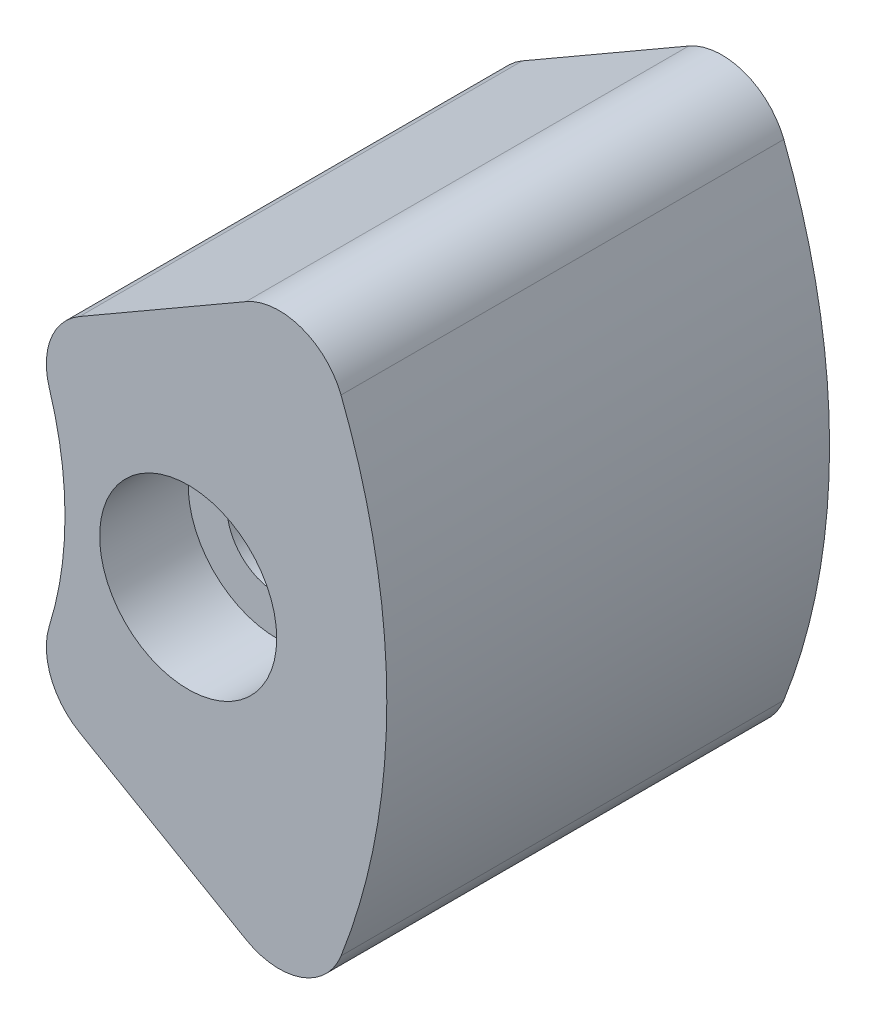
ISO-10303-21;
HEADER;
FILE_DESCRIPTION(('STEP AP214'),'2;1');
FILE_NAME('part.step','',(''),(''),'','','');
FILE_SCHEMA(('AUTOMOTIVE_DESIGN { 1 0 10303 214 1 1 1 1 }'));
ENDSEC;
DATA;
#1=APPLICATION_CONTEXT('core data for automotive mechanical design processes');
#2=APPLICATION_PROTOCOL_DEFINITION('international standard','automotive_design',2000,#1);
#3=PRODUCT_CONTEXT('',#1,'mechanical');
#4=PRODUCT('Part','Part','',(#3));
#5=PRODUCT_RELATED_PRODUCT_CATEGORY('part','',(#4));
#6=PRODUCT_DEFINITION_FORMATION('','',#4);
#7=PRODUCT_DEFINITION_CONTEXT('part definition',#1,'design');
#8=PRODUCT_DEFINITION('design','',#6,#7);
#9=PRODUCT_DEFINITION_SHAPE('','',#8);
#10=(LENGTH_UNIT() NAMED_UNIT(*) SI_UNIT(.MILLI.,.METRE.));
#11=(NAMED_UNIT(*) PLANE_ANGLE_UNIT() SI_UNIT($,.RADIAN.));
#12=(NAMED_UNIT(*) SI_UNIT($,.STERADIAN.) SOLID_ANGLE_UNIT());
#13=UNCERTAINTY_MEASURE_WITH_UNIT(LENGTH_MEASURE(1.E-05),#10,'distance_accuracy_value','');
#14=(GEOMETRIC_REPRESENTATION_CONTEXT(3) GLOBAL_UNCERTAINTY_ASSIGNED_CONTEXT((#13)) GLOBAL_UNIT_ASSIGNED_CONTEXT((#10,
#11,#12)) REPRESENTATION_CONTEXT('',''));
#15=CARTESIAN_POINT('',(0.,0.,0.));
#16=DIRECTION('',(0.,0.,1.));
#17=DIRECTION('',(1.,0.,0.));
#18=AXIS2_PLACEMENT_3D('',#15,#16,#17);
#19=CARTESIAN_POINT('',(233.99144856321,90.1215114657777,20.));
#20=DIRECTION('',(0.,0.,-1.));
#21=DIRECTION('',(-1.,0.,0.));
#22=AXIS2_PLACEMENT_3D('',#19,#20,#21);
#23=CYLINDRICAL_SURFACE('',#22,2.99999999999997);
#24=CARTESIAN_POINT('',(233.99144856321,90.1215114657777,0.));
#25=DIRECTION('',(0.,0.,1.));
#26=DIRECTION('',(1.,0.,0.));
#27=AXIS2_PLACEMENT_3D('',#24,#25,#26);
#28=CIRCLE('',#27,2.99999999999997);
#29=CARTESIAN_POINT('',(232.49144856321,87.5234352544244,0.));
#30=VERTEX_POINT('',#29);
#31=CARTESIAN_POINT('',(236.785753668764,89.0297885260752,0.));
#32=VERTEX_POINT('',#31);
#33=EDGE_CURVE('E128',#30,#32,#28,.T.);
#34=ORIENTED_EDGE('',*,*,#33,.T.);
#35=DIRECTION('',(0.,0.,-1.));
#36=VECTOR('',#35,1.);
#37=CARTESIAN_POINT('',(236.785753668764,89.0297885260752,20.));
#38=LINE('',#37,#36);
#39=CARTESIAN_POINT('',(236.785753668764,89.0297885260752,20.));
#40=VERTEX_POINT('',#39);
#41=EDGE_CURVE('E11',#40,#32,#38,.T.);
#42=ORIENTED_EDGE('',*,*,#41,.F.);
#43=CARTESIAN_POINT('',(233.99144856321,90.1215114657777,20.));
#44=DIRECTION('',(0.,0.,1.));
#45=DIRECTION('',(1.,0.,0.));
#46=AXIS2_PLACEMENT_3D('',#43,#44,#45);
#47=CIRCLE('',#46,2.99999999999997);
#48=CARTESIAN_POINT('',(232.49144856321,87.5234352544244,20.));
#49=VERTEX_POINT('',#48);
#50=EDGE_CURVE('E143',#49,#40,#47,.T.);
#51=ORIENTED_EDGE('',*,*,#50,.F.);
#52=DIRECTION('',(0.,0.,-1.));
#53=VECTOR('',#52,1.);
#54=CARTESIAN_POINT('',(232.49144856321,87.5234352544244,20.));
#55=LINE('',#54,#53);
#56=EDGE_CURVE('E124',#49,#30,#55,.T.);
#57=ORIENTED_EDGE('',*,*,#56,.T.);
#58=EDGE_LOOP('',(#34,#42,#51,#57));
#59=FACE_BOUND('',#58,.T.);
#60=ADVANCED_FACE('F32',(#59),#23,.T.);
#61=CARTESIAN_POINT('',(208.707093034455,100.,20.));
#62=DIRECTION('',(0.,0.,-1.));
#63=DIRECTION('',(-1.,0.,0.));
#64=AXIS2_PLACEMENT_3D('',#61,#62,#63);
#65=CYLINDRICAL_SURFACE('',#64,30.1455920956835);
#66=CARTESIAN_POINT('',(208.707093034455,100.,0.));
#67=DIRECTION('',(0.,0.,1.));
#68=DIRECTION('',(1.,0.,0.));
#69=AXIS2_PLACEMENT_3D('',#66,#67,#68);
#70=CIRCLE('',#69,30.1455920956835);
#71=CARTESIAN_POINT('',(236.785753668764,110.970211473925,0.));
#72=VERTEX_POINT('',#71);
#73=EDGE_CURVE('E131',#32,#72,#70,.T.);
#74=ORIENTED_EDGE('',*,*,#73,.T.);
#75=DIRECTION('',(0.,0.,-1.));
#76=VECTOR('',#75,1.);
#77=CARTESIAN_POINT('',(236.785753668764,110.970211473925,20.));
#78=LINE('',#77,#76);
#79=CARTESIAN_POINT('',(236.785753668764,110.970211473925,20.));
#80=VERTEX_POINT('',#79);
#81=EDGE_CURVE('E40',#80,#72,#78,.T.);
#82=ORIENTED_EDGE('',*,*,#81,.F.);
#83=CARTESIAN_POINT('',(208.707093034455,100.,20.));
#84=DIRECTION('',(0.,0.,1.));
#85=DIRECTION('',(1.,0.,0.));
#86=AXIS2_PLACEMENT_3D('',#83,#84,#85);
#87=CIRCLE('',#86,30.1455920956835);
#88=EDGE_CURVE('E91',#40,#80,#87,.T.);
#89=ORIENTED_EDGE('',*,*,#88,.F.);
#90=ORIENTED_EDGE('',*,*,#41,.T.);
#91=EDGE_LOOP('',(#74,#82,#89,#90));
#92=FACE_BOUND('',#91,.T.);
#93=ADVANCED_FACE('F203',(#92),#65,.T.);
#94=CARTESIAN_POINT('',(233.99144856321,109.878488534222,20.));
#95=DIRECTION('',(0.,0.,-1.));
#96=DIRECTION('',(-1.,0.,0.));
#97=AXIS2_PLACEMENT_3D('',#94,#95,#96);
#98=CYLINDRICAL_SURFACE('',#97,2.99999999999999);
#99=CARTESIAN_POINT('',(233.99144856321,109.878488534222,0.));
#100=DIRECTION('',(0.,0.,1.));
#101=DIRECTION('',(1.,0.,0.));
#102=AXIS2_PLACEMENT_3D('',#99,#100,#101);
#103=CIRCLE('',#102,2.99999999999999);
#104=CARTESIAN_POINT('',(232.49144856321,112.476564745576,0.));
#105=VERTEX_POINT('',#104);
#106=EDGE_CURVE('E134',#72,#105,#103,.T.);
#107=ORIENTED_EDGE('',*,*,#106,.T.);
#108=DIRECTION('',(0.,0.,-1.));
#109=VECTOR('',#108,1.);
#110=CARTESIAN_POINT('',(232.49144856321,112.476564745576,20.));
#111=LINE('',#110,#109);
#112=CARTESIAN_POINT('',(232.49144856321,112.476564745576,20.));
#113=VERTEX_POINT('',#112);
#114=EDGE_CURVE('E150',#113,#105,#111,.T.);
#115=ORIENTED_EDGE('',*,*,#114,.F.);
#116=CARTESIAN_POINT('',(233.99144856321,109.878488534222,20.));
#117=DIRECTION('',(0.,0.,1.));
#118=DIRECTION('',(1.,0.,0.));
#119=AXIS2_PLACEMENT_3D('',#116,#117,#118);
#120=CIRCLE('',#119,2.99999999999999);
#121=EDGE_CURVE('E158',#80,#113,#120,.T.);
#122=ORIENTED_EDGE('',*,*,#121,.F.);
#123=ORIENTED_EDGE('',*,*,#81,.T.);
#124=EDGE_LOOP('',(#107,#115,#122,#123));
#125=FACE_BOUND('',#124,.T.);
#126=ADVANCED_FACE('F156',(#125),#98,.T.);
#127=CARTESIAN_POINT('',(224.973932780992,108.136324985075,20.));
#128=DIRECTION('',(0.500000000000002,-0.866025403784437,0.));
#129=DIRECTION('',(0.866025403784437,0.500000000000002,0.));
#130=AXIS2_PLACEMENT_3D('',#127,#128,#129);
#131=PLANE('',#130);
#132=DIRECTION('',(-0.866025403784437,-0.500000000000002,0.));
#133=VECTOR('',#132,1.);
#134=CARTESIAN_POINT('',(224.973932780992,108.136324985075,0.));
#135=LINE('',#134,#133);
#136=CARTESIAN_POINT('',(224.973932780992,108.136324985075,0.));
#137=VERTEX_POINT('',#136);
#138=EDGE_CURVE('E136',#105,#137,#135,.T.);
#139=ORIENTED_EDGE('',*,*,#138,.T.);
#140=DIRECTION('',(0.,0.,-1.));
#141=VECTOR('',#140,1.);
#142=CARTESIAN_POINT('',(224.973932780992,108.136324985075,20.));
#143=LINE('',#142,#141);
#144=CARTESIAN_POINT('',(224.973932780992,108.136324985075,20.));
#145=VERTEX_POINT('',#144);
#146=EDGE_CURVE('E147',#145,#137,#143,.T.);
#147=ORIENTED_EDGE('',*,*,#146,.F.);
#148=DIRECTION('',(-0.866025403784437,-0.500000000000002,0.));
#149=VECTOR('',#148,1.);
#150=CARTESIAN_POINT('',(224.973932780992,108.136324985075,20.));
#151=LINE('',#150,#149);
#152=EDGE_CURVE('E170',#113,#145,#151,.T.);
#153=ORIENTED_EDGE('',*,*,#152,.F.);
#154=ORIENTED_EDGE('',*,*,#114,.T.);
#155=EDGE_LOOP('',(#139,#147,#153,#154));
#156=FACE_BOUND('',#155,.T.);
#157=ADVANCED_FACE('F166',(#156),#131,.F.);
#158=CARTESIAN_POINT('',(226.473932780992,105.538248773722,20.));
#159=DIRECTION('',(0.,0.,-1.));
#160=DIRECTION('',(-1.,0.,0.));
#161=AXIS2_PLACEMENT_3D('',#158,#159,#160);
#162=CYLINDRICAL_SURFACE('',#161,3.00000000000001);
#163=CARTESIAN_POINT('',(226.473932780992,105.538248773722,0.));
#164=DIRECTION('',(0.,0.,1.));
#165=DIRECTION('',(1.,0.,0.));
#166=AXIS2_PLACEMENT_3D('',#163,#164,#165);
#167=CIRCLE('',#166,3.00000000000001);
#168=CARTESIAN_POINT('',(223.609856164557,104.645463729499,0.));
#169=VERTEX_POINT('',#168);
#170=EDGE_CURVE('E138',#137,#169,#167,.T.);
#171=ORIENTED_EDGE('',*,*,#170,.T.);
#172=DIRECTION('',(0.,0.,-1.));
#173=VECTOR('',#172,1.);
#174=CARTESIAN_POINT('',(223.609856164557,104.645463729499,20.));
#175=LINE('',#174,#173);
#176=CARTESIAN_POINT('',(223.609856164557,104.645463729499,20.));
#177=VERTEX_POINT('',#176);
#178=EDGE_CURVE('E119',#177,#169,#175,.T.);
#179=ORIENTED_EDGE('',*,*,#178,.F.);
#180=CARTESIAN_POINT('',(226.473932780992,105.538248773722,20.));
#181=DIRECTION('',(0.,0.,1.));
#182=DIRECTION('',(1.,0.,0.));
#183=AXIS2_PLACEMENT_3D('',#180,#181,#182);
#184=CIRCLE('',#183,3.00000000000001);
#185=EDGE_CURVE('E110',#145,#177,#184,.T.);
#186=ORIENTED_EDGE('',*,*,#185,.F.);
#187=ORIENTED_EDGE('',*,*,#146,.T.);
#188=EDGE_LOOP('',(#171,#179,#186,#187));
#189=FACE_BOUND('',#188,.T.);
#190=ADVANCED_FACE('F169',(#189),#162,.T.);
#191=CARTESIAN_POINT('',(208.707093034455,100.,20.));
#192=DIRECTION('',(0.,0.,-1.));
#193=DIRECTION('',(-1.,0.,0.));
#194=AXIS2_PLACEMENT_3D('',#191,#192,#193);
#195=CYLINDRICAL_SURFACE('',#194,15.6100186474595);
#196=CARTESIAN_POINT('',(208.707093034455,100.,0.));
#197=DIRECTION('',(0.,0.,-1.));
#198=DIRECTION('',(1.,0.,0.));
#199=AXIS2_PLACEMENT_3D('',#196,#197,#198);
#200=CIRCLE('',#199,15.6100186474595);
#201=CARTESIAN_POINT('',(223.609856164557,95.3545362705012,0.));
#202=VERTEX_POINT('',#201);
#203=EDGE_CURVE('E118',#169,#202,#200,.T.);
#204=ORIENTED_EDGE('',*,*,#203,.T.);
#205=DIRECTION('',(0.,0.,-1.));
#206=VECTOR('',#205,1.);
#207=CARTESIAN_POINT('',(223.609856164557,95.3545362705012,20.));
#208=LINE('',#207,#206);
#209=CARTESIAN_POINT('',(223.609856164557,95.3545362705012,20.));
#210=VERTEX_POINT('',#209);
#211=EDGE_CURVE('E115',#210,#202,#208,.T.);
#212=ORIENTED_EDGE('',*,*,#211,.F.);
#213=CARTESIAN_POINT('',(208.707093034455,100.,20.));
#214=DIRECTION('',(0.,0.,-1.));
#215=DIRECTION('',(1.,0.,0.));
#216=AXIS2_PLACEMENT_3D('',#213,#214,#215);
#217=CIRCLE('',#216,15.6100186474595);
#218=EDGE_CURVE('E104',#177,#210,#217,.T.);
#219=ORIENTED_EDGE('',*,*,#218,.F.);
#220=ORIENTED_EDGE('',*,*,#178,.T.);
#221=EDGE_LOOP('',(#204,#212,#219,#220));
#222=FACE_BOUND('',#221,.T.);
#223=ADVANCED_FACE('F116',(#222),#195,.F.);
#224=CARTESIAN_POINT('',(226.473932780992,94.461751226278,20.));
#225=DIRECTION('',(0.,0.,-1.));
#226=DIRECTION('',(-1.,0.,0.));
#227=AXIS2_PLACEMENT_3D('',#224,#225,#226);
#228=CYLINDRICAL_SURFACE('',#227,3.);
#229=CARTESIAN_POINT('',(226.473932780992,94.461751226278,0.));
#230=DIRECTION('',(0.,0.,1.));
#231=DIRECTION('',(1.,0.,0.));
#232=AXIS2_PLACEMENT_3D('',#229,#230,#231);
#233=CIRCLE('',#232,3.);
#234=CARTESIAN_POINT('',(224.973932780992,91.8636750149247,0.));
#235=VERTEX_POINT('',#234);
#236=EDGE_CURVE('E77',#202,#235,#233,.T.);
#237=ORIENTED_EDGE('',*,*,#236,.T.);
#238=DIRECTION('',(0.,0.,-1.));
#239=VECTOR('',#238,1.);
#240=CARTESIAN_POINT('',(224.973932780992,91.8636750149247,20.));
#241=LINE('',#240,#239);
#242=CARTESIAN_POINT('',(224.973932780992,91.8636750149247,20.));
#243=VERTEX_POINT('',#242);
#244=EDGE_CURVE('E120',#243,#235,#241,.T.);
#245=ORIENTED_EDGE('',*,*,#244,.F.);
#246=CARTESIAN_POINT('',(226.473932780992,94.461751226278,20.));
#247=DIRECTION('',(0.,0.,1.));
#248=DIRECTION('',(1.,0.,0.));
#249=AXIS2_PLACEMENT_3D('',#246,#247,#248);
#250=CIRCLE('',#249,3.);
#251=EDGE_CURVE('E108',#210,#243,#250,.T.);
#252=ORIENTED_EDGE('',*,*,#251,.F.);
#253=ORIENTED_EDGE('',*,*,#211,.T.);
#254=EDGE_LOOP('',(#237,#245,#252,#253));
#255=FACE_BOUND('',#254,.T.);
#256=ADVANCED_FACE('F122',(#255),#228,.T.);
#257=CARTESIAN_POINT('',(224.973932780992,91.8636750149247,20.));
#258=DIRECTION('',(0.5,0.866025403784439,0.));
#259=DIRECTION('',(-0.866025403784439,0.5,0.));
#260=AXIS2_PLACEMENT_3D('',#257,#258,#259);
#261=PLANE('',#260);
#262=DIRECTION('',(0.866025403784439,-0.5,0.));
#263=VECTOR('',#262,1.);
#264=CARTESIAN_POINT('',(224.973932780992,91.8636750149247,0.));
#265=LINE('',#264,#263);
#266=EDGE_CURVE('E83',#235,#30,#265,.T.);
#267=ORIENTED_EDGE('',*,*,#266,.T.);
#268=ORIENTED_EDGE('',*,*,#56,.F.);
#269=DIRECTION('',(0.866025403784439,-0.5,0.));
#270=VECTOR('',#269,1.);
#271=CARTESIAN_POINT('',(224.973932780992,91.8636750149247,20.));
#272=LINE('',#271,#270);
#273=EDGE_CURVE('E48',#243,#49,#272,.T.);
#274=ORIENTED_EDGE('',*,*,#273,.F.);
#275=ORIENTED_EDGE('',*,*,#244,.T.);
#276=EDGE_LOOP('',(#267,#268,#274,#275));
#277=FACE_BOUND('',#276,.T.);
#278=ADVANCED_FACE('F191',(#277),#261,.F.);
#279=CARTESIAN_POINT('',(233.99144856321,90.1215114657777,20.));
#280=DIRECTION('',(0.,0.,1.));
#281=DIRECTION('',(1.,0.,0.));
#282=AXIS2_PLACEMENT_3D('',#279,#280,#281);
#283=PLANE('',#282);
#284=CARTESIAN_POINT('',(229.88140451995,100.,20.));
#285=DIRECTION('',(0.,0.,1.));
#286=DIRECTION('',(1.,0.,0.));
#287=AXIS2_PLACEMENT_3D('',#284,#285,#286);
#288=CIRCLE('',#287,4.);
#289=CARTESIAN_POINT('',(233.88140451995,100.,20.));
#290=VERTEX_POINT('',#289);
#291=EDGE_CURVE('E184',#290,#290,#288,.T.);
#292=ORIENTED_EDGE('',*,*,#291,.F.);
#293=EDGE_LOOP('',(#292));
#294=FACE_BOUND('',#293,.T.);
#295=ORIENTED_EDGE('',*,*,#50,.T.);
#296=ORIENTED_EDGE('',*,*,#88,.T.);
#297=ORIENTED_EDGE('',*,*,#121,.T.);
#298=ORIENTED_EDGE('',*,*,#152,.T.);
#299=ORIENTED_EDGE('',*,*,#185,.T.);
#300=ORIENTED_EDGE('',*,*,#218,.T.);
#301=ORIENTED_EDGE('',*,*,#251,.T.);
#302=ORIENTED_EDGE('',*,*,#273,.T.);
#303=EDGE_LOOP('',(#295,#296,#297,#298,#299,#300,#301,#302));
#304=FACE_BOUND('',#303,.T.);
#305=ADVANCED_FACE('F106',(#294,#304),#283,.T.);
#306=CARTESIAN_POINT('',(233.99144856321,90.1215114657777,0.));
#307=DIRECTION('',(0.,0.,1.));
#308=DIRECTION('',(1.,0.,0.));
#309=AXIS2_PLACEMENT_3D('',#306,#307,#308);
#310=PLANE('',#309);
#311=CARTESIAN_POINT('',(229.88140451995,100.,0.));
#312=DIRECTION('',(0.,0.,1.));
#313=DIRECTION('',(1.,0.,0.));
#314=AXIS2_PLACEMENT_3D('',#311,#312,#313);
#315=CIRCLE('',#314,2.25);
#316=CARTESIAN_POINT('',(232.13140451995,100.,0.));
#317=VERTEX_POINT('',#316);
#318=EDGE_CURVE('E132',#317,#317,#315,.T.);
#319=ORIENTED_EDGE('',*,*,#318,.T.);
#320=EDGE_LOOP('',(#319));
#321=FACE_BOUND('',#320,.T.);
#322=ORIENTED_EDGE('',*,*,#33,.F.);
#323=ORIENTED_EDGE('',*,*,#266,.F.);
#324=ORIENTED_EDGE('',*,*,#236,.F.);
#325=ORIENTED_EDGE('',*,*,#203,.F.);
#326=ORIENTED_EDGE('',*,*,#170,.F.);
#327=ORIENTED_EDGE('',*,*,#138,.F.);
#328=ORIENTED_EDGE('',*,*,#106,.F.);
#329=ORIENTED_EDGE('',*,*,#73,.F.);
#330=EDGE_LOOP('',(#322,#323,#324,#325,#326,#327,#328,#329));
#331=FACE_BOUND('',#330,.T.);
#332=ADVANCED_FACE('F162',(#321,#331),#310,.F.);
#333=CARTESIAN_POINT('',(229.88140451995,100.,20.));
#334=DIRECTION('',(0.,0.,1.));
#335=DIRECTION('',(1.,0.,0.));
#336=AXIS2_PLACEMENT_3D('',#333,#334,#335);
#337=CYLINDRICAL_SURFACE('',#336,2.25);
#338=ORIENTED_EDGE('',*,*,#318,.F.);
#339=EDGE_LOOP('',(#338));
#340=FACE_BOUND('',#339,.T.);
#341=CARTESIAN_POINT('',(229.88140451995,100.,16.));
#342=DIRECTION('',(0.,0.,1.));
#343=DIRECTION('',(1.,0.,0.));
#344=AXIS2_PLACEMENT_3D('',#341,#342,#343);
#345=CIRCLE('',#344,2.25);
#346=CARTESIAN_POINT('',(232.13140451995,100.,16.));
#347=VERTEX_POINT('',#346);
#348=EDGE_CURVE('E178',#347,#347,#345,.T.);
#349=ORIENTED_EDGE('',*,*,#348,.T.);
#350=EDGE_LOOP('',(#349));
#351=FACE_BOUND('',#350,.T.);
#352=ADVANCED_FACE('F197',(#340,#351),#337,.F.);
#353=CARTESIAN_POINT('',(232.13140451995,100.,16.));
#354=DIRECTION('',(0.,0.,-1.));
#355=DIRECTION('',(-1.,0.,0.));
#356=AXIS2_PLACEMENT_3D('',#353,#354,#355);
#357=PLANE('',#356);
#358=ORIENTED_EDGE('',*,*,#348,.F.);
#359=EDGE_LOOP('',(#358));
#360=FACE_BOUND('',#359,.T.);
#361=CARTESIAN_POINT('',(229.88140451995,100.,16.));
#362=DIRECTION('',(0.,0.,1.));
#363=DIRECTION('',(1.,0.,0.));
#364=AXIS2_PLACEMENT_3D('',#361,#362,#363);
#365=CIRCLE('',#364,4.);
#366=CARTESIAN_POINT('',(233.88140451995,100.,16.));
#367=VERTEX_POINT('',#366);
#368=EDGE_CURVE('E181',#367,#367,#365,.T.);
#369=ORIENTED_EDGE('',*,*,#368,.T.);
#370=EDGE_LOOP('',(#369));
#371=FACE_BOUND('',#370,.T.);
#372=ADVANCED_FACE('F249',(#360,#371),#357,.F.);
#373=CARTESIAN_POINT('',(229.88140451995,100.,20.));
#374=DIRECTION('',(0.,0.,1.));
#375=DIRECTION('',(1.,0.,0.));
#376=AXIS2_PLACEMENT_3D('',#373,#374,#375);
#377=CYLINDRICAL_SURFACE('',#376,4.);
#378=ORIENTED_EDGE('',*,*,#368,.F.);
#379=EDGE_LOOP('',(#378));
#380=FACE_BOUND('',#379,.T.);
#381=ORIENTED_EDGE('',*,*,#291,.T.);
#382=EDGE_LOOP('',(#381));
#383=FACE_BOUND('',#382,.T.);
#384=ADVANCED_FACE('F188',(#380,#383),#377,.F.);
#385=CLOSED_SHELL('',(#60,#93,#126,#157,#190,#223,#256,#278,#305,#332,#352,#372,#384));
#386=MANIFOLD_SOLID_BREP('B2',#385);
#387=ADVANCED_BREP_SHAPE_REPRESENTATION('',(#18,#386),#14);
#388=SHAPE_DEFINITION_REPRESENTATION(#9,#387);
ENDSEC;
END-ISO-10303-21;
